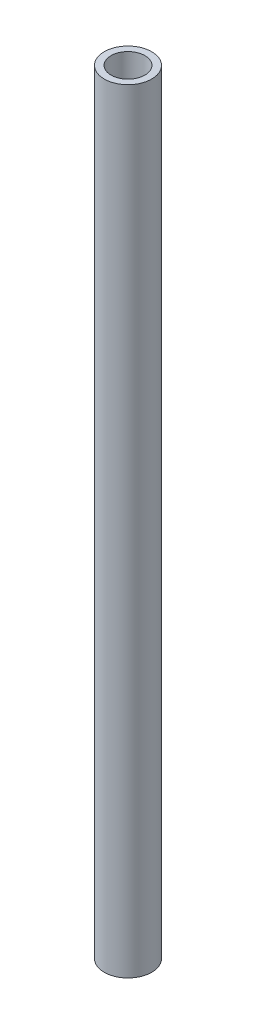
ISO-10303-21;
HEADER;
FILE_DESCRIPTION(('STEP AP214'),'2;1');
FILE_NAME('part.step','',(''),(''),'','','');
FILE_SCHEMA(('AUTOMOTIVE_DESIGN { 1 0 10303 214 1 1 1 1 }'));
ENDSEC;
DATA;
#1=APPLICATION_CONTEXT('core data for automotive mechanical design processes');
#2=APPLICATION_PROTOCOL_DEFINITION('international standard','automotive_design',2000,#1);
#3=PRODUCT_CONTEXT('',#1,'mechanical');
#4=PRODUCT('Part','Part','',(#3));
#5=PRODUCT_RELATED_PRODUCT_CATEGORY('part','',(#4));
#6=PRODUCT_DEFINITION_FORMATION('','',#4);
#7=PRODUCT_DEFINITION_CONTEXT('part definition',#1,'design');
#8=PRODUCT_DEFINITION('design','',#6,#7);
#9=PRODUCT_DEFINITION_SHAPE('','',#8);
#10=(LENGTH_UNIT() NAMED_UNIT(*) SI_UNIT(.MILLI.,.METRE.));
#11=(NAMED_UNIT(*) PLANE_ANGLE_UNIT() SI_UNIT($,.RADIAN.));
#12=(NAMED_UNIT(*) SI_UNIT($,.STERADIAN.) SOLID_ANGLE_UNIT());
#13=UNCERTAINTY_MEASURE_WITH_UNIT(LENGTH_MEASURE(1.E-05),#10,'distance_accuracy_value','');
#14=(GEOMETRIC_REPRESENTATION_CONTEXT(3) GLOBAL_UNCERTAINTY_ASSIGNED_CONTEXT((#13)) GLOBAL_UNIT_ASSIGNED_CONTEXT((#10,
#11,#12)) REPRESENTATION_CONTEXT('',''));
#15=CARTESIAN_POINT('',(0.,0.,0.));
#16=DIRECTION('',(0.,0.,1.));
#17=DIRECTION('',(1.,0.,0.));
#18=AXIS2_PLACEMENT_3D('',#15,#16,#17);
#19=CARTESIAN_POINT('',(0.,228.4,0.));
#20=DIRECTION('',(0.,-1.,0.));
#21=DIRECTION('',(0.,0.,-1.));
#22=AXIS2_PLACEMENT_3D('',#19,#20,#21);
#23=CYLINDRICAL_SURFACE('',#22,4.);
#24=CARTESIAN_POINT('',(0.,31.,0.));
#25=DIRECTION('',(0.,1.,0.));
#26=DIRECTION('',(0.,0.,1.));
#27=AXIS2_PLACEMENT_3D('',#24,#25,#26);
#28=CIRCLE('',#27,4.);
#29=CARTESIAN_POINT('',(0.,31.,4.));
#30=VERTEX_POINT('',#29);
#31=EDGE_CURVE('E39',#30,#30,#28,.T.);
#32=ORIENTED_EDGE('',*,*,#31,.F.);
#33=EDGE_LOOP('',(#32));
#34=FACE_BOUND('',#33,.T.);
#35=CARTESIAN_POINT('',(0.,197.4,0.));
#36=DIRECTION('',(0.,1.,0.));
#37=DIRECTION('',(0.,0.,1.));
#38=AXIS2_PLACEMENT_3D('',#35,#36,#37);
#39=CIRCLE('',#38,4.);
#40=CARTESIAN_POINT('',(0.,197.4,4.));
#41=VERTEX_POINT('',#40);
#42=EDGE_CURVE('E48',#41,#41,#39,.T.);
#43=ORIENTED_EDGE('',*,*,#42,.T.);
#44=EDGE_LOOP('',(#43));
#45=FACE_BOUND('',#44,.T.);
#46=ADVANCED_FACE('F35',(#34,#45),#23,.F.);
#47=CARTESIAN_POINT('',(0.,228.4,0.));
#48=DIRECTION('',(0.,1.,0.));
#49=DIRECTION('',(0.,0.,1.));
#50=AXIS2_PLACEMENT_3D('',#47,#48,#49);
#51=PLANE('',#50);
#52=CARTESIAN_POINT('',(0.,228.4,0.));
#53=DIRECTION('',(0.,1.,0.));
#54=DIRECTION('',(0.,0.,1.));
#55=AXIS2_PLACEMENT_3D('',#52,#53,#54);
#56=CIRCLE('',#55,5.);
#57=CARTESIAN_POINT('',(0.,228.4,5.));
#58=VERTEX_POINT('',#57);
#59=EDGE_CURVE('E51',#58,#58,#56,.T.);
#60=ORIENTED_EDGE('',*,*,#59,.F.);
#61=EDGE_LOOP('',(#60));
#62=FACE_BOUND('',#61,.T.);
#63=CARTESIAN_POINT('',(0.,228.4,0.));
#64=DIRECTION('',(0.,1.,0.));
#65=DIRECTION('',(0.,0.,1.));
#66=AXIS2_PLACEMENT_3D('',#63,#64,#65);
#67=CIRCLE('',#66,7.);
#68=CARTESIAN_POINT('',(0.,228.4,7.));
#69=VERTEX_POINT('',#68);
#70=EDGE_CURVE('E10',#69,#69,#67,.T.);
#71=ORIENTED_EDGE('',*,*,#70,.T.);
#72=EDGE_LOOP('',(#71));
#73=FACE_BOUND('',#72,.T.);
#74=ADVANCED_FACE('F76',(#62,#73),#51,.T.);
#75=CARTESIAN_POINT('',(0.,0.,0.));
#76=DIRECTION('',(0.,1.,0.));
#77=DIRECTION('',(0.,0.,1.));
#78=AXIS2_PLACEMENT_3D('',#75,#76,#77);
#79=PLANE('',#78);
#80=CARTESIAN_POINT('',(0.,0.,0.));
#81=DIRECTION('',(0.,1.,0.));
#82=DIRECTION('',(0.,0.,1.));
#83=AXIS2_PLACEMENT_3D('',#80,#81,#82);
#84=CIRCLE('',#83,5.);
#85=CARTESIAN_POINT('',(0.,0.,5.));
#86=VERTEX_POINT('',#85);
#87=EDGE_CURVE('E62',#86,#86,#84,.T.);
#88=ORIENTED_EDGE('',*,*,#87,.T.);
#89=EDGE_LOOP('',(#88));
#90=FACE_BOUND('',#89,.T.);
#91=CARTESIAN_POINT('',(0.,0.,0.));
#92=DIRECTION('',(0.,1.,0.));
#93=DIRECTION('',(0.,0.,1.));
#94=AXIS2_PLACEMENT_3D('',#91,#92,#93);
#95=CIRCLE('',#94,7.);
#96=CARTESIAN_POINT('',(0.,0.,7.));
#97=VERTEX_POINT('',#96);
#98=EDGE_CURVE('E43',#97,#97,#95,.T.);
#99=ORIENTED_EDGE('',*,*,#98,.F.);
#100=EDGE_LOOP('',(#99));
#101=FACE_BOUND('',#100,.T.);
#102=ADVANCED_FACE('F81',(#90,#101),#79,.F.);
#103=CARTESIAN_POINT('',(0.,228.4,0.));
#104=DIRECTION('',(0.,-1.,0.));
#105=DIRECTION('',(0.,0.,-1.));
#106=AXIS2_PLACEMENT_3D('',#103,#104,#105);
#107=CYLINDRICAL_SURFACE('',#106,7.);
#108=ORIENTED_EDGE('',*,*,#70,.F.);
#109=EDGE_LOOP('',(#108));
#110=FACE_BOUND('',#109,.T.);
#111=ORIENTED_EDGE('',*,*,#98,.T.);
#112=EDGE_LOOP('',(#111));
#113=FACE_BOUND('',#112,.T.);
#114=ADVANCED_FACE('F37',(#110,#113),#107,.T.);
#115=CARTESIAN_POINT('',(0.,197.4,0.));
#116=DIRECTION('',(0.,1.,0.));
#117=DIRECTION('',(0.,0.,1.));
#118=AXIS2_PLACEMENT_3D('',#115,#116,#117);
#119=CYLINDRICAL_SURFACE('',#118,5.);
#120=CARTESIAN_POINT('',(0.,197.4,0.));
#121=DIRECTION('',(0.,1.,0.));
#122=DIRECTION('',(0.,0.,1.));
#123=AXIS2_PLACEMENT_3D('',#120,#121,#122);
#124=CIRCLE('',#123,5.);
#125=CARTESIAN_POINT('',(0.,197.4,5.));
#126=VERTEX_POINT('',#125);
#127=EDGE_CURVE('E54',#126,#126,#124,.T.);
#128=ORIENTED_EDGE('',*,*,#127,.F.);
#129=EDGE_LOOP('',(#128));
#130=FACE_BOUND('',#129,.T.);
#131=ORIENTED_EDGE('',*,*,#59,.T.);
#132=EDGE_LOOP('',(#131));
#133=FACE_BOUND('',#132,.T.);
#134=ADVANCED_FACE('F85',(#130,#133),#119,.F.);
#135=CARTESIAN_POINT('',(0.,197.4,0.));
#136=DIRECTION('',(0.,1.,0.));
#137=DIRECTION('',(0.,0.,1.));
#138=AXIS2_PLACEMENT_3D('',#135,#136,#137);
#139=PLANE('',#138);
#140=ORIENTED_EDGE('',*,*,#42,.F.);
#141=EDGE_LOOP('',(#140));
#142=FACE_BOUND('',#141,.T.);
#143=ORIENTED_EDGE('',*,*,#127,.T.);
#144=EDGE_LOOP('',(#143));
#145=FACE_BOUND('',#144,.T.);
#146=ADVANCED_FACE('F100',(#142,#145),#139,.T.);
#147=CARTESIAN_POINT('',(0.,31.,0.));
#148=DIRECTION('',(0.,-1.,0.));
#149=DIRECTION('',(0.,0.,-1.));
#150=AXIS2_PLACEMENT_3D('',#147,#148,#149);
#151=CYLINDRICAL_SURFACE('',#150,5.);
#152=CARTESIAN_POINT('',(0.,31.,0.));
#153=DIRECTION('',(0.,1.,0.));
#154=DIRECTION('',(0.,0.,1.));
#155=AXIS2_PLACEMENT_3D('',#152,#153,#154);
#156=CIRCLE('',#155,5.);
#157=CARTESIAN_POINT('',(0.,31.,5.));
#158=VERTEX_POINT('',#157);
#159=EDGE_CURVE('E65',#158,#158,#156,.T.);
#160=ORIENTED_EDGE('',*,*,#159,.T.);
#161=EDGE_LOOP('',(#160));
#162=FACE_BOUND('',#161,.T.);
#163=ORIENTED_EDGE('',*,*,#87,.F.);
#164=EDGE_LOOP('',(#163));
#165=FACE_BOUND('',#164,.T.);
#166=ADVANCED_FACE('F98',(#162,#165),#151,.F.);
#167=CARTESIAN_POINT('',(0.,31.,0.));
#168=DIRECTION('',(0.,1.,0.));
#169=DIRECTION('',(0.,0.,1.));
#170=AXIS2_PLACEMENT_3D('',#167,#168,#169);
#171=PLANE('',#170);
#172=ORIENTED_EDGE('',*,*,#31,.T.);
#173=EDGE_LOOP('',(#172));
#174=FACE_BOUND('',#173,.T.);
#175=ORIENTED_EDGE('',*,*,#159,.F.);
#176=EDGE_LOOP('',(#175));
#177=FACE_BOUND('',#176,.T.);
#178=ADVANCED_FACE('F72',(#174,#177),#171,.F.);
#179=CLOSED_SHELL('',(#46,#74,#102,#114,#134,#146,#166,#178));
#180=MANIFOLD_SOLID_BREP('B2',#179);
#181=ADVANCED_BREP_SHAPE_REPRESENTATION('',(#18,#180),#14);
#182=SHAPE_DEFINITION_REPRESENTATION(#9,#181);
ENDSEC;
END-ISO-10303-21;
